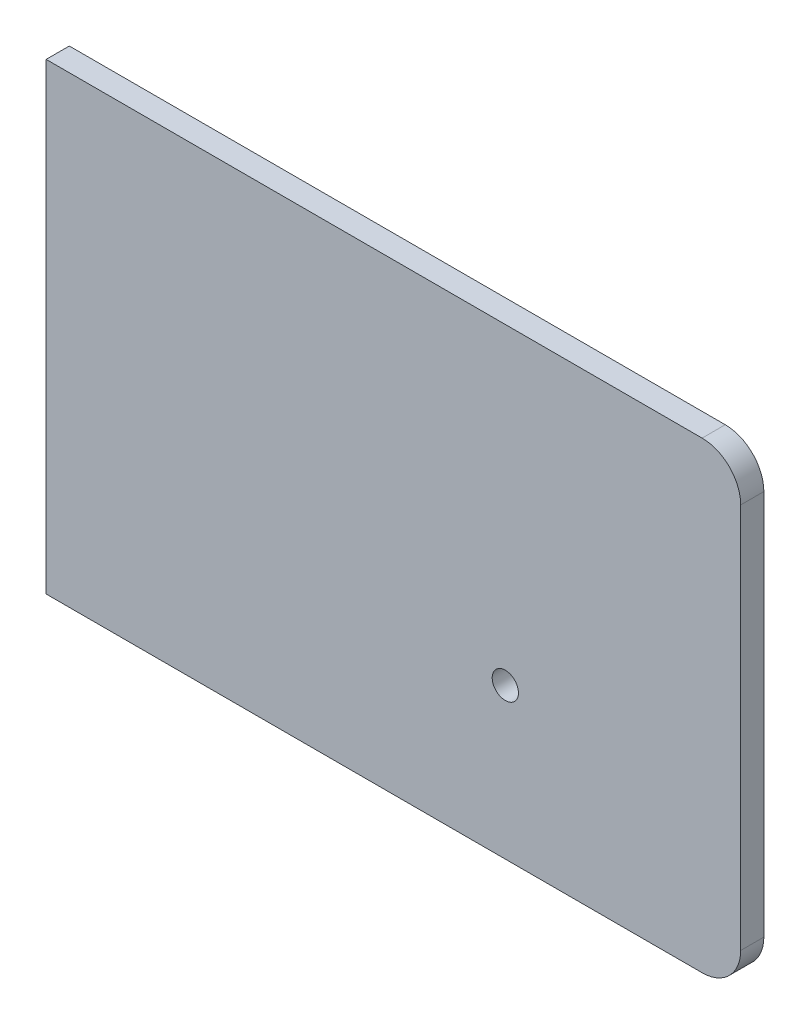
ISO-10303-21;
HEADER;
FILE_DESCRIPTION(('STEP AP214'),'2;1');
FILE_NAME('part.step','',(''),(''),'','','');
FILE_SCHEMA(('AUTOMOTIVE_DESIGN { 1 0 10303 214 1 1 1 1 }'));
ENDSEC;
DATA;
#1=APPLICATION_CONTEXT('core data for automotive mechanical design processes');
#2=APPLICATION_PROTOCOL_DEFINITION('international standard','automotive_design',2000,#1);
#3=PRODUCT_CONTEXT('',#1,'mechanical');
#4=PRODUCT('Part','Part','',(#3));
#5=PRODUCT_RELATED_PRODUCT_CATEGORY('part','',(#4));
#6=PRODUCT_DEFINITION_FORMATION('','',#4);
#7=PRODUCT_DEFINITION_CONTEXT('part definition',#1,'design');
#8=PRODUCT_DEFINITION('design','',#6,#7);
#9=PRODUCT_DEFINITION_SHAPE('','',#8);
#10=(LENGTH_UNIT() NAMED_UNIT(*) SI_UNIT(.MILLI.,.METRE.));
#11=(NAMED_UNIT(*) PLANE_ANGLE_UNIT() SI_UNIT($,.RADIAN.));
#12=(NAMED_UNIT(*) SI_UNIT($,.STERADIAN.) SOLID_ANGLE_UNIT());
#13=UNCERTAINTY_MEASURE_WITH_UNIT(LENGTH_MEASURE(1.E-05),#10,'distance_accuracy_value','');
#14=(GEOMETRIC_REPRESENTATION_CONTEXT(3) GLOBAL_UNCERTAINTY_ASSIGNED_CONTEXT((#13)) GLOBAL_UNIT_ASSIGNED_CONTEXT((#10,
#11,#12)) REPRESENTATION_CONTEXT('',''));
#15=CARTESIAN_POINT('',(0.,0.,0.));
#16=DIRECTION('',(0.,0.,1.));
#17=DIRECTION('',(1.,0.,0.));
#18=AXIS2_PLACEMENT_3D('',#15,#16,#17);
#19=CARTESIAN_POINT('',(202.677406728923,0.,6.));
#20=DIRECTION('',(1.,0.,0.));
#21=DIRECTION('',(0.,0.,-1.));
#22=AXIS2_PLACEMENT_3D('',#19,#20,#21);
#23=PLANE('',#22);
#24=DIRECTION('',(0.,-1.,0.));
#25=VECTOR('',#24,1.);
#26=CARTESIAN_POINT('',(202.677406728923,0.,6.));
#27=LINE('',#26,#25);
#28=CARTESIAN_POINT('',(202.677406728923,398.328575942871,6.));
#29=VERTEX_POINT('',#28);
#30=CARTESIAN_POINT('',(202.677406728923,298.328575942871,6.));
#31=VERTEX_POINT('',#30);
#32=EDGE_CURVE('E111',#29,#31,#27,.T.);
#33=ORIENTED_EDGE('',*,*,#32,.T.);
#34=DIRECTION('',(0.,0.,-1.));
#35=VECTOR('',#34,1.);
#36=CARTESIAN_POINT('',(202.677406728923,298.328575942871,0.));
#37=LINE('',#36,#35);
#38=CARTESIAN_POINT('',(202.677406728923,298.328575942871,0.));
#39=VERTEX_POINT('',#38);
#40=EDGE_CURVE('E132',#31,#39,#37,.T.);
#41=ORIENTED_EDGE('',*,*,#40,.T.);
#42=DIRECTION('',(0.,-1.,0.));
#43=VECTOR('',#42,1.);
#44=CARTESIAN_POINT('',(202.677406728923,0.,0.));
#45=LINE('',#44,#43);
#46=CARTESIAN_POINT('',(202.677406728923,398.328575942871,0.));
#47=VERTEX_POINT('',#46);
#48=EDGE_CURVE('E122',#47,#39,#45,.T.);
#49=ORIENTED_EDGE('',*,*,#48,.F.);
#50=DIRECTION('',(0.,0.,-1.));
#51=VECTOR('',#50,1.);
#52=CARTESIAN_POINT('',(202.677406728923,398.328575942871,6.));
#53=LINE('',#52,#51);
#54=EDGE_CURVE('E100',#47,#29,#53,.F.);
#55=ORIENTED_EDGE('',*,*,#54,.T.);
#56=EDGE_LOOP('',(#33,#41,#49,#55));
#57=FACE_BOUND('',#56,.T.);
#58=ADVANCED_FACE('F35',(#57),#23,.T.);
#59=CARTESIAN_POINT('',(0.,408.328575942871,6.));
#60=DIRECTION('',(0.,1.,0.));
#61=DIRECTION('',(0.,0.,1.));
#62=AXIS2_PLACEMENT_3D('',#59,#60,#61);
#63=PLANE('',#62);
#64=DIRECTION('',(1.,0.,0.));
#65=VECTOR('',#64,1.);
#66=CARTESIAN_POINT('',(0.,408.328575942871,6.));
#67=LINE('',#66,#65);
#68=CARTESIAN_POINT('',(22.6774067289232,408.328575942871,6.));
#69=VERTEX_POINT('',#68);
#70=CARTESIAN_POINT('',(192.677406728923,408.328575942871,6.));
#71=VERTEX_POINT('',#70);
#72=EDGE_CURVE('E93',#69,#71,#67,.T.);
#73=ORIENTED_EDGE('',*,*,#72,.T.);
#74=DIRECTION('',(0.,0.,-1.));
#75=VECTOR('',#74,1.);
#76=CARTESIAN_POINT('',(192.677406728923,408.328575942871,6.));
#77=LINE('',#76,#75);
#78=CARTESIAN_POINT('',(192.677406728923,408.328575942871,0.));
#79=VERTEX_POINT('',#78);
#80=EDGE_CURVE('E11',#71,#79,#77,.T.);
#81=ORIENTED_EDGE('',*,*,#80,.T.);
#82=DIRECTION('',(1.,0.,0.));
#83=VECTOR('',#82,1.);
#84=CARTESIAN_POINT('',(0.,408.328575942871,0.));
#85=LINE('',#84,#83);
#86=CARTESIAN_POINT('',(22.6774067289232,408.328575942871,0.));
#87=VERTEX_POINT('',#86);
#88=EDGE_CURVE('E96',#87,#79,#85,.T.);
#89=ORIENTED_EDGE('',*,*,#88,.F.);
#90=DIRECTION('',(0.,0.,-1.));
#91=VECTOR('',#90,1.);
#92=CARTESIAN_POINT('',(22.6774067289232,408.328575942871,6.));
#93=LINE('',#92,#91);
#94=EDGE_CURVE('E90',#69,#87,#93,.T.);
#95=ORIENTED_EDGE('',*,*,#94,.F.);
#96=EDGE_LOOP('',(#73,#81,#89,#95));
#97=FACE_BOUND('',#96,.T.);
#98=ADVANCED_FACE('F92',(#97),#63,.T.);
#99=CARTESIAN_POINT('',(22.6774067289233,0.,6.));
#100=DIRECTION('',(1.,0.,0.));
#101=DIRECTION('',(0.,1.,0.));
#102=AXIS2_PLACEMENT_3D('',#99,#100,#101);
#103=PLANE('',#102);
#104=DIRECTION('',(0.,-1.,0.));
#105=VECTOR('',#104,1.);
#106=CARTESIAN_POINT('',(22.6774067289233,0.,0.));
#107=LINE('',#106,#105);
#108=CARTESIAN_POINT('',(22.6774067289232,288.328575942871,0.));
#109=VERTEX_POINT('',#108);
#110=EDGE_CURVE('E126',#87,#109,#107,.T.);
#111=ORIENTED_EDGE('',*,*,#110,.T.);
#112=DIRECTION('',(0.,0.,-1.));
#113=VECTOR('',#112,1.);
#114=CARTESIAN_POINT('',(22.6774067289232,288.328575942871,6.));
#115=LINE('',#114,#113);
#116=CARTESIAN_POINT('',(22.6774067289232,288.328575942871,6.));
#117=VERTEX_POINT('',#116);
#118=EDGE_CURVE('E101',#117,#109,#115,.T.);
#119=ORIENTED_EDGE('',*,*,#118,.F.);
#120=DIRECTION('',(0.,-1.,0.));
#121=VECTOR('',#120,1.);
#122=CARTESIAN_POINT('',(22.6774067289233,0.,6.));
#123=LINE('',#122,#121);
#124=EDGE_CURVE('E105',#69,#117,#123,.T.);
#125=ORIENTED_EDGE('',*,*,#124,.F.);
#126=ORIENTED_EDGE('',*,*,#94,.T.);
#127=EDGE_LOOP('',(#111,#119,#125,#126));
#128=FACE_BOUND('',#127,.T.);
#129=ADVANCED_FACE('F106',(#128),#103,.F.);
#130=CARTESIAN_POINT('',(141.677406728932,327.32857594286,6.));
#131=DIRECTION('',(0.,0.,-1.));
#132=DIRECTION('',(-1.,0.,0.));
#133=AXIS2_PLACEMENT_3D('',#130,#131,#132);
#134=CYLINDRICAL_SURFACE('',#133,3.40000000000003);
#135=CARTESIAN_POINT('',(141.677406728932,327.32857594286,6.));
#136=DIRECTION('',(0.,0.,1.));
#137=DIRECTION('',(1.,0.,0.));
#138=AXIS2_PLACEMENT_3D('',#135,#136,#137);
#139=CIRCLE('',#138,3.40000000000003);
#140=CARTESIAN_POINT('',(145.077406728933,327.32857594286,6.));
#141=VERTEX_POINT('',#140);
#142=EDGE_CURVE('E114',#141,#141,#139,.T.);
#143=ORIENTED_EDGE('',*,*,#142,.T.);
#144=EDGE_LOOP('',(#143));
#145=FACE_BOUND('',#144,.T.);
#146=CARTESIAN_POINT('',(141.677406728932,327.32857594286,0.));
#147=DIRECTION('',(0.,0.,1.));
#148=DIRECTION('',(1.,0.,0.));
#149=AXIS2_PLACEMENT_3D('',#146,#147,#148);
#150=CIRCLE('',#149,3.40000000000003);
#151=CARTESIAN_POINT('',(145.077406728933,327.32857594286,0.));
#152=VERTEX_POINT('',#151);
#153=EDGE_CURVE('E119',#152,#152,#150,.T.);
#154=ORIENTED_EDGE('',*,*,#153,.F.);
#155=EDGE_LOOP('',(#154));
#156=FACE_BOUND('',#155,.T.);
#157=ADVANCED_FACE('F163',(#145,#156),#134,.F.);
#158=CARTESIAN_POINT('',(0.,288.328575942871,6.));
#159=DIRECTION('',(0.,1.,0.));
#160=DIRECTION('',(0.,0.,1.));
#161=AXIS2_PLACEMENT_3D('',#158,#159,#160);
#162=PLANE('',#161);
#163=DIRECTION('',(1.,0.,0.));
#164=VECTOR('',#163,1.);
#165=CARTESIAN_POINT('',(0.,288.328575942871,0.));
#166=LINE('',#165,#164);
#167=CARTESIAN_POINT('',(192.677406728923,288.328575942871,0.));
#168=VERTEX_POINT('',#167);
#169=EDGE_CURVE('E128',#109,#168,#166,.T.);
#170=ORIENTED_EDGE('',*,*,#169,.T.);
#171=DIRECTION('',(0.,0.,-1.));
#172=VECTOR('',#171,1.);
#173=CARTESIAN_POINT('',(192.677406728923,288.328575942871,6.));
#174=LINE('',#173,#172);
#175=CARTESIAN_POINT('',(192.677406728923,288.328575942871,6.));
#176=VERTEX_POINT('',#175);
#177=EDGE_CURVE('E58',#168,#176,#174,.F.);
#178=ORIENTED_EDGE('',*,*,#177,.T.);
#179=DIRECTION('',(1.,0.,0.));
#180=VECTOR('',#179,1.);
#181=CARTESIAN_POINT('',(0.,288.328575942871,6.));
#182=LINE('',#181,#180);
#183=EDGE_CURVE('E108',#117,#176,#182,.T.);
#184=ORIENTED_EDGE('',*,*,#183,.F.);
#185=ORIENTED_EDGE('',*,*,#118,.T.);
#186=EDGE_LOOP('',(#170,#178,#184,#185));
#187=FACE_BOUND('',#186,.T.);
#188=ADVANCED_FACE('F149',(#187),#162,.F.);
#189=CARTESIAN_POINT('',(0.,0.,6.));
#190=DIRECTION('',(0.,0.,1.));
#191=DIRECTION('',(1.,0.,0.));
#192=AXIS2_PLACEMENT_3D('',#189,#190,#191);
#193=PLANE('',#192);
#194=ORIENTED_EDGE('',*,*,#142,.F.);
#195=EDGE_LOOP('',(#194));
#196=FACE_BOUND('',#195,.T.);
#197=ORIENTED_EDGE('',*,*,#183,.T.);
#198=CARTESIAN_POINT('',(192.677406728923,298.328575942871,6.));
#199=DIRECTION('',(0.,0.,1.));
#200=DIRECTION('',(1.,0.,0.));
#201=AXIS2_PLACEMENT_3D('',#198,#199,#200);
#202=CIRCLE('',#201,10.);
#203=EDGE_CURVE('E43',#176,#31,#202,.T.);
#204=ORIENTED_EDGE('',*,*,#203,.T.);
#205=ORIENTED_EDGE('',*,*,#32,.F.);
#206=CARTESIAN_POINT('',(192.677406728923,398.328575942871,6.));
#207=DIRECTION('',(0.,0.,1.));
#208=DIRECTION('',(1.,0.,0.));
#209=AXIS2_PLACEMENT_3D('',#206,#207,#208);
#210=CIRCLE('',#209,10.);
#211=EDGE_CURVE('E50',#29,#71,#210,.T.);
#212=ORIENTED_EDGE('',*,*,#211,.T.);
#213=ORIENTED_EDGE('',*,*,#72,.F.);
#214=ORIENTED_EDGE('',*,*,#124,.T.);
#215=EDGE_LOOP('',(#197,#204,#205,#212,#213,#214));
#216=FACE_BOUND('',#215,.T.);
#217=ADVANCED_FACE('F110',(#196,#216),#193,.T.);
#218=CARTESIAN_POINT('',(0.,0.,0.));
#219=DIRECTION('',(0.,0.,1.));
#220=DIRECTION('',(1.,0.,0.));
#221=AXIS2_PLACEMENT_3D('',#218,#219,#220);
#222=PLANE('',#221);
#223=ORIENTED_EDGE('',*,*,#153,.T.);
#224=EDGE_LOOP('',(#223));
#225=FACE_BOUND('',#224,.T.);
#226=ORIENTED_EDGE('',*,*,#48,.T.);
#227=CARTESIAN_POINT('',(192.677406728923,298.328575942871,0.));
#228=DIRECTION('',(0.,0.,1.));
#229=DIRECTION('',(1.,0.,0.));
#230=AXIS2_PLACEMENT_3D('',#227,#228,#229);
#231=CIRCLE('',#230,10.);
#232=EDGE_CURVE('E137',#39,#168,#231,.F.);
#233=ORIENTED_EDGE('',*,*,#232,.T.);
#234=ORIENTED_EDGE('',*,*,#169,.F.);
#235=ORIENTED_EDGE('',*,*,#110,.F.);
#236=ORIENTED_EDGE('',*,*,#88,.T.);
#237=CARTESIAN_POINT('',(192.677406728923,398.328575942871,0.));
#238=DIRECTION('',(0.,0.,1.));
#239=DIRECTION('',(1.,0.,0.));
#240=AXIS2_PLACEMENT_3D('',#237,#238,#239);
#241=CIRCLE('',#240,10.);
#242=EDGE_CURVE('E135',#79,#47,#241,.F.);
#243=ORIENTED_EDGE('',*,*,#242,.T.);
#244=EDGE_LOOP('',(#226,#233,#234,#235,#236,#243));
#245=FACE_BOUND('',#244,.T.);
#246=ADVANCED_FACE('F148',(#225,#245),#222,.F.);
#247=CARTESIAN_POINT('',(192.677406728923,298.328575942871,6.));
#248=DIRECTION('',(0.,0.,1.));
#249=DIRECTION('',(1.,0.,0.));
#250=AXIS2_PLACEMENT_3D('',#247,#248,#249);
#251=CYLINDRICAL_SURFACE('',#250,10.);
#252=ORIENTED_EDGE('',*,*,#203,.F.);
#253=ORIENTED_EDGE('',*,*,#177,.F.);
#254=ORIENTED_EDGE('',*,*,#232,.F.);
#255=ORIENTED_EDGE('',*,*,#40,.F.);
#256=EDGE_LOOP('',(#252,#253,#254,#255));
#257=FACE_BOUND('',#256,.T.);
#258=ADVANCED_FACE('F146',(#257),#251,.T.);
#259=CARTESIAN_POINT('',(192.677406728923,398.328575942871,6.));
#260=DIRECTION('',(0.,0.,-1.));
#261=DIRECTION('',(-1.,0.,0.));
#262=AXIS2_PLACEMENT_3D('',#259,#260,#261);
#263=CYLINDRICAL_SURFACE('',#262,10.);
#264=ORIENTED_EDGE('',*,*,#211,.F.);
#265=ORIENTED_EDGE('',*,*,#54,.F.);
#266=ORIENTED_EDGE('',*,*,#242,.F.);
#267=ORIENTED_EDGE('',*,*,#80,.F.);
#268=EDGE_LOOP('',(#264,#265,#266,#267));
#269=FACE_BOUND('',#268,.T.);
#270=ADVANCED_FACE('F37',(#269),#263,.T.);
#271=CLOSED_SHELL('',(#58,#98,#129,#157,#188,#217,#246,#258,#270));
#272=MANIFOLD_SOLID_BREP('B2',#271);
#273=ADVANCED_BREP_SHAPE_REPRESENTATION('',(#18,#272),#14);
#274=SHAPE_DEFINITION_REPRESENTATION(#9,#273);
ENDSEC;
END-ISO-10303-21;
